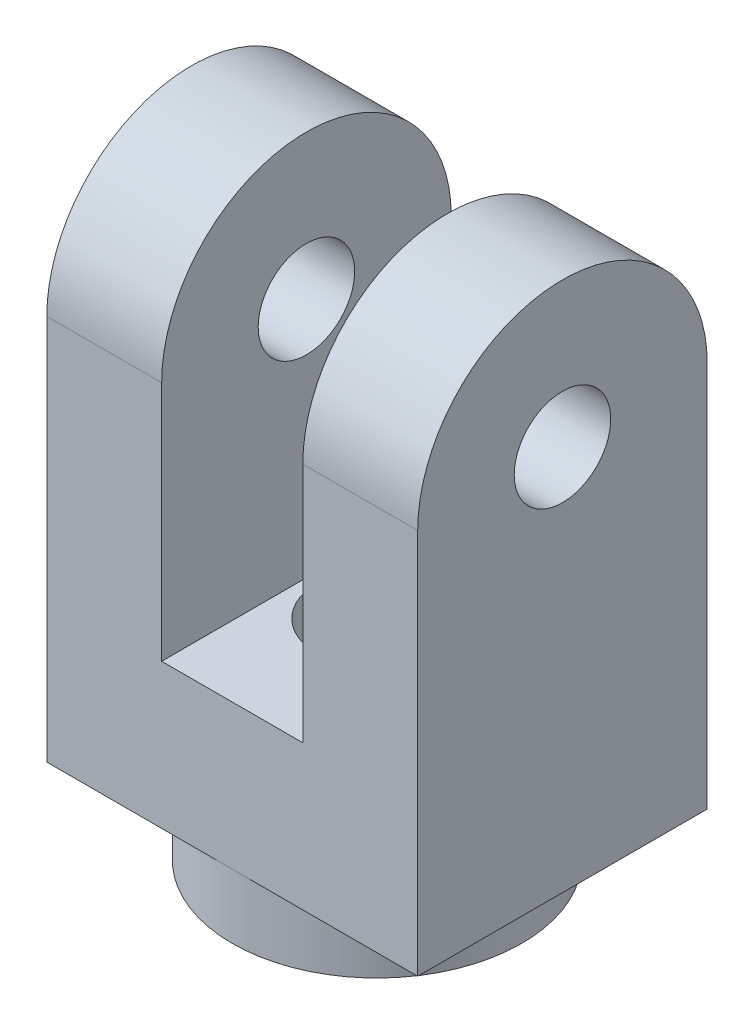
ISO-10303-21;
HEADER;
FILE_DESCRIPTION(('STEP AP214'),'2;1');
FILE_NAME('part.step','',(''),(''),'','','');
FILE_SCHEMA(('AUTOMOTIVE_DESIGN { 1 0 10303 214 1 1 1 1 }'));
ENDSEC;
DATA;
#1=APPLICATION_CONTEXT('core data for automotive mechanical design processes');
#2=APPLICATION_PROTOCOL_DEFINITION('international standard','automotive_design',2000,#1);
#3=PRODUCT_CONTEXT('',#1,'mechanical');
#4=PRODUCT('Part','Part','',(#3));
#5=PRODUCT_RELATED_PRODUCT_CATEGORY('part','',(#4));
#6=PRODUCT_DEFINITION_FORMATION('','',#4);
#7=PRODUCT_DEFINITION_CONTEXT('part definition',#1,'design');
#8=PRODUCT_DEFINITION('design','',#6,#7);
#9=PRODUCT_DEFINITION_SHAPE('','',#8);
#10=(LENGTH_UNIT() NAMED_UNIT(*) SI_UNIT(.MILLI.,.METRE.));
#11=(NAMED_UNIT(*) PLANE_ANGLE_UNIT() SI_UNIT($,.RADIAN.));
#12=(NAMED_UNIT(*) SI_UNIT($,.STERADIAN.) SOLID_ANGLE_UNIT());
#13=UNCERTAINTY_MEASURE_WITH_UNIT(LENGTH_MEASURE(1.E-05),#10,'distance_accuracy_value','');
#14=(GEOMETRIC_REPRESENTATION_CONTEXT(3) GLOBAL_UNCERTAINTY_ASSIGNED_CONTEXT((#13)) GLOBAL_UNIT_ASSIGNED_CONTEXT((#10,
#11,#12)) REPRESENTATION_CONTEXT('',''));
#15=CARTESIAN_POINT('',(0.,0.,0.));
#16=DIRECTION('',(0.,0.,1.));
#17=DIRECTION('',(1.,0.,0.));
#18=AXIS2_PLACEMENT_3D('',#15,#16,#17);
#19=CARTESIAN_POINT('',(0.,36.,0.));
#20=DIRECTION('',(0.,1.,0.));
#21=DIRECTION('',(0.,0.,1.));
#22=AXIS2_PLACEMENT_3D('',#19,#20,#21);
#23=PLANE('',#22);
#24=CARTESIAN_POINT('',(0.,36.,0.));
#25=DIRECTION('',(0.,1.,0.));
#26=DIRECTION('',(0.,0.,1.));
#27=AXIS2_PLACEMENT_3D('',#24,#25,#26);
#28=CIRCLE('',#27,15.);
#29=CARTESIAN_POINT('',(0.,36.,15.));
#30=VERTEX_POINT('',#29);
#31=EDGE_CURVE('E185',#30,#30,#28,.T.);
#32=ORIENTED_EDGE('',*,*,#31,.F.);
#33=EDGE_LOOP('',(#32));
#34=FACE_BOUND('',#33,.T.);
#35=DIRECTION('',(1.,0.,0.));
#36=VECTOR('',#35,1.);
#37=CARTESIAN_POINT('',(0.,36.,36.));
#38=LINE('',#37,#36);
#39=CARTESIAN_POINT('',(-17.55,36.,36.));
#40=VERTEX_POINT('',#39);
#41=CARTESIAN_POINT('',(17.55,36.,36.));
#42=VERTEX_POINT('',#41);
#43=EDGE_CURVE('E179',#40,#42,#38,.T.);
#44=ORIENTED_EDGE('',*,*,#43,.T.);
#45=DIRECTION('',(0.,0.,1.));
#46=VECTOR('',#45,1.);
#47=CARTESIAN_POINT('',(17.55,36.,-36.));
#48=LINE('',#47,#46);
#49=CARTESIAN_POINT('',(17.55,36.,-36.));
#50=VERTEX_POINT('',#49);
#51=EDGE_CURVE('E121',#50,#42,#48,.T.);
#52=ORIENTED_EDGE('',*,*,#51,.F.);
#53=DIRECTION('',(1.,0.,0.));
#54=VECTOR('',#53,1.);
#55=CARTESIAN_POINT('',(0.,36.,-36.));
#56=LINE('',#55,#54);
#57=CARTESIAN_POINT('',(-17.55,36.,-36.));
#58=VERTEX_POINT('',#57);
#59=EDGE_CURVE('E181',#58,#50,#56,.T.);
#60=ORIENTED_EDGE('',*,*,#59,.F.);
#61=DIRECTION('',(0.,0.,1.));
#62=VECTOR('',#61,1.);
#63=CARTESIAN_POINT('',(-17.55,36.,-36.));
#64=LINE('',#63,#62);
#65=EDGE_CURVE('E161',#58,#40,#64,.T.);
#66=ORIENTED_EDGE('',*,*,#65,.T.);
#67=EDGE_LOOP('',(#44,#52,#60,#66));
#68=FACE_BOUND('',#67,.T.);
#69=ADVANCED_FACE('F41',(#34,#68),#23,.T.);
#70=CARTESIAN_POINT('',(0.,0.,0.));
#71=DIRECTION('',(0.,1.,0.));
#72=DIRECTION('',(0.,0.,1.));
#73=AXIS2_PLACEMENT_3D('',#70,#71,#72);
#74=PLANE('',#73);
#75=DIRECTION('',(1.,0.,0.));
#76=VECTOR('',#75,1.);
#77=CARTESIAN_POINT('',(0.,0.,36.));
#78=LINE('',#77,#76);
#79=CARTESIAN_POINT('',(0.,0.,36.));
#80=VERTEX_POINT('',#79);
#81=CARTESIAN_POINT('',(46.125,0.,36.));
#82=VERTEX_POINT('',#81);
#83=EDGE_CURVE('E177',#80,#82,#78,.T.);
#84=ORIENTED_EDGE('',*,*,#83,.F.);
#85=CARTESIAN_POINT('',(0.,0.,0.));
#86=DIRECTION('',(0.,1.,0.));
#87=DIRECTION('',(0.,0.,1.));
#88=AXIS2_PLACEMENT_3D('',#85,#86,#87);
#89=CIRCLE('',#88,36.);
#90=CARTESIAN_POINT('',(0.,0.,-36.));
#91=VERTEX_POINT('',#90);
#92=EDGE_CURVE('E51',#80,#91,#89,.T.);
#93=ORIENTED_EDGE('',*,*,#92,.T.);
#94=DIRECTION('',(1.,0.,0.));
#95=VECTOR('',#94,1.);
#96=CARTESIAN_POINT('',(0.,0.,-36.));
#97=LINE('',#96,#95);
#98=CARTESIAN_POINT('',(46.125,0.,-36.));
#99=VERTEX_POINT('',#98);
#100=EDGE_CURVE('E195',#91,#99,#97,.T.);
#101=ORIENTED_EDGE('',*,*,#100,.T.);
#102=DIRECTION('',(0.,0.,1.));
#103=VECTOR('',#102,1.);
#104=CARTESIAN_POINT('',(46.125,0.,0.));
#105=LINE('',#104,#103);
#106=EDGE_CURVE('E192',#99,#82,#105,.T.);
#107=ORIENTED_EDGE('',*,*,#106,.T.);
#108=EDGE_LOOP('',(#84,#93,#101,#107));
#109=FACE_BOUND('',#108,.T.);
#110=ADVANCED_FACE('F213',(#109),#74,.F.);
#111=CARTESIAN_POINT('',(0.,36.,36.));
#112=DIRECTION('',(0.,0.,-1.));
#113=DIRECTION('',(-1.,0.,0.));
#114=AXIS2_PLACEMENT_3D('',#111,#112,#113);
#115=PLANE('',#114);
#116=DIRECTION('',(0.,-1.,0.));
#117=VECTOR('',#116,1.);
#118=CARTESIAN_POINT('',(-46.125,36.,36.));
#119=LINE('',#118,#117);
#120=CARTESIAN_POINT('',(-46.125,96.,36.));
#121=VERTEX_POINT('',#120);
#122=CARTESIAN_POINT('',(-46.125,0.,36.));
#123=VERTEX_POINT('',#122);
#124=EDGE_CURVE('E188',#121,#123,#119,.T.);
#125=ORIENTED_EDGE('',*,*,#124,.T.);
#126=EDGE_CURVE('E189',#123,#80,#78,.T.);
#127=ORIENTED_EDGE('',*,*,#126,.T.);
#128=ORIENTED_EDGE('',*,*,#83,.T.);
#129=DIRECTION('',(0.,-1.,0.));
#130=VECTOR('',#129,1.);
#131=CARTESIAN_POINT('',(46.125,36.,36.));
#132=LINE('',#131,#130);
#133=CARTESIAN_POINT('',(46.125,96.,36.));
#134=VERTEX_POINT('',#133);
#135=EDGE_CURVE('E45',#134,#82,#132,.T.);
#136=ORIENTED_EDGE('',*,*,#135,.F.);
#137=DIRECTION('',(1.,0.,0.));
#138=VECTOR('',#137,1.);
#139=CARTESIAN_POINT('',(17.55,96.,36.));
#140=LINE('',#139,#138);
#141=CARTESIAN_POINT('',(17.55,96.,36.));
#142=VERTEX_POINT('',#141);
#143=EDGE_CURVE('E127',#142,#134,#140,.T.);
#144=ORIENTED_EDGE('',*,*,#143,.F.);
#145=DIRECTION('',(0.,1.,0.));
#146=VECTOR('',#145,1.);
#147=CARTESIAN_POINT('',(17.55,36.,36.));
#148=LINE('',#147,#146);
#149=EDGE_CURVE('E113',#42,#142,#148,.T.);
#150=ORIENTED_EDGE('',*,*,#149,.F.);
#151=ORIENTED_EDGE('',*,*,#43,.F.);
#152=DIRECTION('',(0.,1.,0.));
#153=VECTOR('',#152,1.);
#154=CARTESIAN_POINT('',(-17.55,36.,36.));
#155=LINE('',#154,#153);
#156=CARTESIAN_POINT('',(-17.55,96.,36.));
#157=VERTEX_POINT('',#156);
#158=EDGE_CURVE('E58',#40,#157,#155,.T.);
#159=ORIENTED_EDGE('',*,*,#158,.T.);
#160=DIRECTION('',(-1.,0.,0.));
#161=VECTOR('',#160,1.);
#162=CARTESIAN_POINT('',(-17.55,96.,36.));
#163=LINE('',#162,#161);
#164=EDGE_CURVE('E167',#157,#121,#163,.T.);
#165=ORIENTED_EDGE('',*,*,#164,.T.);
#166=EDGE_LOOP('',(#125,#127,#128,#136,#144,#150,#151,#159,#165));
#167=FACE_BOUND('',#166,.T.);
#168=ADVANCED_FACE('F43',(#167),#115,.F.);
#169=CARTESIAN_POINT('',(46.125,36.,0.));
#170=DIRECTION('',(1.,0.,0.));
#171=DIRECTION('',(0.,0.,-1.));
#172=AXIS2_PLACEMENT_3D('',#169,#170,#171);
#173=PLANE('',#172);
#174=ORIENTED_EDGE('',*,*,#106,.F.);
#175=DIRECTION('',(0.,-1.,0.));
#176=VECTOR('',#175,1.);
#177=CARTESIAN_POINT('',(46.125,36.,-36.));
#178=LINE('',#177,#176);
#179=CARTESIAN_POINT('',(46.125,96.,-36.));
#180=VERTEX_POINT('',#179);
#181=EDGE_CURVE('E203',#180,#99,#178,.T.);
#182=ORIENTED_EDGE('',*,*,#181,.F.);
#183=CARTESIAN_POINT('',(46.125,96.,0.));
#184=DIRECTION('',(-1.,0.,0.));
#185=DIRECTION('',(0.,0.,1.));
#186=AXIS2_PLACEMENT_3D('',#183,#184,#185);
#187=CIRCLE('',#186,36.);
#188=EDGE_CURVE('E137',#134,#180,#187,.T.);
#189=ORIENTED_EDGE('',*,*,#188,.F.);
#190=ORIENTED_EDGE('',*,*,#135,.T.);
#191=EDGE_LOOP('',(#174,#182,#189,#190));
#192=FACE_BOUND('',#191,.T.);
#193=CARTESIAN_POINT('',(46.125,96.,0.));
#194=DIRECTION('',(-1.,0.,0.));
#195=DIRECTION('',(0.,0.,1.));
#196=AXIS2_PLACEMENT_3D('',#193,#194,#195);
#197=CIRCLE('',#196,12.);
#198=CARTESIAN_POINT('',(46.125,96.,12.));
#199=VERTEX_POINT('',#198);
#200=EDGE_CURVE('E142',#199,#199,#197,.T.);
#201=ORIENTED_EDGE('',*,*,#200,.T.);
#202=EDGE_LOOP('',(#201));
#203=FACE_BOUND('',#202,.T.);
#204=ADVANCED_FACE('F209',(#192,#203),#173,.T.);
#205=CARTESIAN_POINT('',(0.,36.,-36.));
#206=DIRECTION('',(0.,0.,-1.));
#207=DIRECTION('',(-1.,0.,0.));
#208=AXIS2_PLACEMENT_3D('',#205,#206,#207);
#209=PLANE('',#208);
#210=DIRECTION('',(0.,-1.,0.));
#211=VECTOR('',#210,1.);
#212=CARTESIAN_POINT('',(-17.55,36.,-36.));
#213=LINE('',#212,#211);
#214=CARTESIAN_POINT('',(-17.55,96.,-36.));
#215=VERTEX_POINT('',#214);
#216=EDGE_CURVE('E158',#215,#58,#213,.T.);
#217=ORIENTED_EDGE('',*,*,#216,.T.);
#218=ORIENTED_EDGE('',*,*,#59,.T.);
#219=DIRECTION('',(0.,-1.,0.));
#220=VECTOR('',#219,1.);
#221=CARTESIAN_POINT('',(17.55,36.,-36.));
#222=LINE('',#221,#220);
#223=CARTESIAN_POINT('',(17.55,96.,-36.));
#224=VERTEX_POINT('',#223);
#225=EDGE_CURVE('E133',#224,#50,#222,.T.);
#226=ORIENTED_EDGE('',*,*,#225,.F.);
#227=DIRECTION('',(1.,0.,0.));
#228=VECTOR('',#227,1.);
#229=CARTESIAN_POINT('',(17.55,96.,-36.));
#230=LINE('',#229,#228);
#231=EDGE_CURVE('E132',#224,#180,#230,.T.);
#232=ORIENTED_EDGE('',*,*,#231,.T.);
#233=ORIENTED_EDGE('',*,*,#181,.T.);
#234=ORIENTED_EDGE('',*,*,#100,.F.);
#235=CARTESIAN_POINT('',(-46.125,0.,-36.));
#236=VERTEX_POINT('',#235);
#237=EDGE_CURVE('E196',#236,#91,#97,.T.);
#238=ORIENTED_EDGE('',*,*,#237,.F.);
#239=DIRECTION('',(0.,-1.,0.));
#240=VECTOR('',#239,1.);
#241=CARTESIAN_POINT('',(-46.125,36.,-36.));
#242=LINE('',#241,#240);
#243=CARTESIAN_POINT('',(-46.125,96.,-36.));
#244=VERTEX_POINT('',#243);
#245=EDGE_CURVE('E202',#244,#236,#242,.T.);
#246=ORIENTED_EDGE('',*,*,#245,.F.);
#247=DIRECTION('',(-1.,0.,0.));
#248=VECTOR('',#247,1.);
#249=CARTESIAN_POINT('',(-17.55,96.,-36.));
#250=LINE('',#249,#248);
#251=EDGE_CURVE('E164',#215,#244,#250,.T.);
#252=ORIENTED_EDGE('',*,*,#251,.F.);
#253=EDGE_LOOP('',(#217,#218,#226,#232,#233,#234,#238,#246,#252));
#254=FACE_BOUND('',#253,.T.);
#255=ADVANCED_FACE('F215',(#254),#209,.T.);
#256=CARTESIAN_POINT('',(-46.125,36.,0.));
#257=DIRECTION('',(1.,0.,0.));
#258=DIRECTION('',(0.,0.,-1.));
#259=AXIS2_PLACEMENT_3D('',#256,#257,#258);
#260=PLANE('',#259);
#261=ORIENTED_EDGE('',*,*,#245,.T.);
#262=DIRECTION('',(0.,0.,1.));
#263=VECTOR('',#262,1.);
#264=CARTESIAN_POINT('',(-46.125,0.,0.));
#265=LINE('',#264,#263);
#266=EDGE_CURVE('E182',#236,#123,#265,.T.);
#267=ORIENTED_EDGE('',*,*,#266,.T.);
#268=ORIENTED_EDGE('',*,*,#124,.F.);
#269=CARTESIAN_POINT('',(-46.125,96.,0.));
#270=DIRECTION('',(-1.,0.,0.));
#271=DIRECTION('',(0.,0.,1.));
#272=AXIS2_PLACEMENT_3D('',#269,#270,#271);
#273=CIRCLE('',#272,36.);
#274=EDGE_CURVE('E152',#121,#244,#273,.T.);
#275=ORIENTED_EDGE('',*,*,#274,.T.);
#276=EDGE_LOOP('',(#261,#267,#268,#275));
#277=FACE_BOUND('',#276,.T.);
#278=CARTESIAN_POINT('',(-46.125,96.,0.));
#279=DIRECTION('',(-1.,0.,0.));
#280=DIRECTION('',(0.,0.,1.));
#281=AXIS2_PLACEMENT_3D('',#278,#279,#280);
#282=CIRCLE('',#281,12.);
#283=CARTESIAN_POINT('',(-46.125,96.,12.));
#284=VERTEX_POINT('',#283);
#285=EDGE_CURVE('E147',#284,#284,#282,.T.);
#286=ORIENTED_EDGE('',*,*,#285,.F.);
#287=EDGE_LOOP('',(#286));
#288=FACE_BOUND('',#287,.T.);
#289=ADVANCED_FACE('F221',(#277,#288),#260,.F.);
#290=CARTESIAN_POINT('',(0.,36.,0.));
#291=DIRECTION('',(0.,-1.,0.));
#292=DIRECTION('',(0.,0.,-1.));
#293=AXIS2_PLACEMENT_3D('',#290,#291,#292);
#294=CYLINDRICAL_SURFACE('',#293,15.);
#295=ORIENTED_EDGE('',*,*,#31,.T.);
#296=EDGE_LOOP('',(#295));
#297=FACE_BOUND('',#296,.T.);
#298=CARTESIAN_POINT('',(0.,-16.,0.));
#299=DIRECTION('',(0.,1.,0.));
#300=DIRECTION('',(0.,0.,1.));
#301=AXIS2_PLACEMENT_3D('',#298,#299,#300);
#302=CIRCLE('',#301,15.);
#303=CARTESIAN_POINT('',(0.,-16.,15.));
#304=VERTEX_POINT('',#303);
#305=EDGE_CURVE('E172',#304,#304,#302,.T.);
#306=ORIENTED_EDGE('',*,*,#305,.F.);
#307=EDGE_LOOP('',(#306));
#308=FACE_BOUND('',#307,.T.);
#309=ADVANCED_FACE('F243',(#297,#308),#294,.F.);
#310=ORIENTED_EDGE('',*,*,#237,.T.);
#311=EDGE_CURVE('E11',#91,#80,#89,.T.);
#312=ORIENTED_EDGE('',*,*,#311,.T.);
#313=ORIENTED_EDGE('',*,*,#126,.F.);
#314=ORIENTED_EDGE('',*,*,#266,.F.);
#315=EDGE_LOOP('',(#310,#312,#313,#314));
#316=FACE_BOUND('',#315,.T.);
#317=ADVANCED_FACE('F218',(#316),#74,.F.);
#318=CARTESIAN_POINT('',(0.,-16.,0.));
#319=DIRECTION('',(0.,1.,0.));
#320=DIRECTION('',(0.,0.,1.));
#321=AXIS2_PLACEMENT_3D('',#318,#319,#320);
#322=CYLINDRICAL_SURFACE('',#321,36.);
#323=CARTESIAN_POINT('',(0.,-16.,0.));
#324=DIRECTION('',(0.,1.,0.));
#325=DIRECTION('',(0.,0.,1.));
#326=AXIS2_PLACEMENT_3D('',#323,#324,#325);
#327=CIRCLE('',#326,36.);
#328=CARTESIAN_POINT('',(0.,-16.,36.));
#329=VERTEX_POINT('',#328);
#330=EDGE_CURVE('E175',#329,#329,#327,.T.);
#331=ORIENTED_EDGE('',*,*,#330,.T.);
#332=EDGE_LOOP('',(#331));
#333=FACE_BOUND('',#332,.T.);
#334=ORIENTED_EDGE('',*,*,#92,.F.);
#335=ORIENTED_EDGE('',*,*,#311,.F.);
#336=EDGE_LOOP('',(#334,#335));
#337=FACE_BOUND('',#336,.T.);
#338=ADVANCED_FACE('F239',(#333,#337),#322,.T.);
#339=CARTESIAN_POINT('',(0.,-16.,0.));
#340=DIRECTION('',(0.,1.,0.));
#341=DIRECTION('',(0.,0.,1.));
#342=AXIS2_PLACEMENT_3D('',#339,#340,#341);
#343=PLANE('',#342);
#344=ORIENTED_EDGE('',*,*,#305,.T.);
#345=EDGE_LOOP('',(#344));
#346=FACE_BOUND('',#345,.T.);
#347=ORIENTED_EDGE('',*,*,#330,.F.);
#348=EDGE_LOOP('',(#347));
#349=FACE_BOUND('',#348,.T.);
#350=ADVANCED_FACE('F279',(#346,#349),#343,.F.);
#351=CARTESIAN_POINT('',(-17.55,96.,0.));
#352=DIRECTION('',(-1.,0.,0.));
#353=DIRECTION('',(0.,0.,1.));
#354=AXIS2_PLACEMENT_3D('',#351,#352,#353);
#355=CYLINDRICAL_SURFACE('',#354,36.);
#356=ORIENTED_EDGE('',*,*,#274,.F.);
#357=ORIENTED_EDGE('',*,*,#164,.F.);
#358=CARTESIAN_POINT('',(-17.55,96.,0.));
#359=DIRECTION('',(-1.,0.,0.));
#360=DIRECTION('',(0.,0.,1.));
#361=AXIS2_PLACEMENT_3D('',#358,#359,#360);
#362=CIRCLE('',#361,36.);
#363=EDGE_CURVE('E155',#157,#215,#362,.T.);
#364=ORIENTED_EDGE('',*,*,#363,.T.);
#365=ORIENTED_EDGE('',*,*,#251,.T.);
#366=EDGE_LOOP('',(#356,#357,#364,#365));
#367=FACE_BOUND('',#366,.T.);
#368=ADVANCED_FACE('F226',(#367),#355,.T.);
#369=CARTESIAN_POINT('',(-17.55,96.,0.));
#370=DIRECTION('',(-1.,0.,0.));
#371=DIRECTION('',(0.,0.,1.));
#372=AXIS2_PLACEMENT_3D('',#369,#370,#371);
#373=PLANE('',#372);
#374=CARTESIAN_POINT('',(-17.55,96.,0.));
#375=DIRECTION('',(-1.,0.,0.));
#376=DIRECTION('',(0.,0.,1.));
#377=AXIS2_PLACEMENT_3D('',#374,#375,#376);
#378=CIRCLE('',#377,12.);
#379=CARTESIAN_POINT('',(-17.55,96.,12.));
#380=VERTEX_POINT('',#379);
#381=EDGE_CURVE('E149',#380,#380,#378,.T.);
#382=ORIENTED_EDGE('',*,*,#381,.T.);
#383=EDGE_LOOP('',(#382));
#384=FACE_BOUND('',#383,.T.);
#385=ORIENTED_EDGE('',*,*,#363,.F.);
#386=ORIENTED_EDGE('',*,*,#158,.F.);
#387=ORIENTED_EDGE('',*,*,#65,.F.);
#388=ORIENTED_EDGE('',*,*,#216,.F.);
#389=EDGE_LOOP('',(#385,#386,#387,#388));
#390=FACE_BOUND('',#389,.T.);
#391=ADVANCED_FACE('F227',(#384,#390),#373,.F.);
#392=CARTESIAN_POINT('',(-17.55,96.,0.));
#393=DIRECTION('',(-1.,0.,0.));
#394=DIRECTION('',(0.,0.,1.));
#395=AXIS2_PLACEMENT_3D('',#392,#393,#394);
#396=CYLINDRICAL_SURFACE('',#395,12.);
#397=ORIENTED_EDGE('',*,*,#381,.F.);
#398=EDGE_LOOP('',(#397));
#399=FACE_BOUND('',#398,.T.);
#400=ORIENTED_EDGE('',*,*,#285,.T.);
#401=EDGE_LOOP('',(#400));
#402=FACE_BOUND('',#401,.T.);
#403=ADVANCED_FACE('F306',(#399,#402),#396,.F.);
#404=CARTESIAN_POINT('',(17.55,96.,0.));
#405=DIRECTION('',(1.,0.,0.));
#406=DIRECTION('',(0.,0.,1.));
#407=AXIS2_PLACEMENT_3D('',#404,#405,#406);
#408=PLANE('',#407);
#409=CARTESIAN_POINT('',(17.55,96.,0.));
#410=DIRECTION('',(-1.,0.,0.));
#411=DIRECTION('',(0.,0.,1.));
#412=AXIS2_PLACEMENT_3D('',#409,#410,#411);
#413=CIRCLE('',#412,36.);
#414=EDGE_CURVE('E118',#142,#224,#413,.T.);
#415=ORIENTED_EDGE('',*,*,#414,.T.);
#416=ORIENTED_EDGE('',*,*,#225,.T.);
#417=ORIENTED_EDGE('',*,*,#51,.T.);
#418=ORIENTED_EDGE('',*,*,#149,.T.);
#419=EDGE_LOOP('',(#415,#416,#417,#418));
#420=FACE_BOUND('',#419,.T.);
#421=CARTESIAN_POINT('',(17.55,96.,0.));
#422=DIRECTION('',(-1.,0.,0.));
#423=DIRECTION('',(0.,0.,1.));
#424=AXIS2_PLACEMENT_3D('',#421,#422,#423);
#425=CIRCLE('',#424,12.);
#426=CARTESIAN_POINT('',(17.55,96.,12.));
#427=VERTEX_POINT('',#426);
#428=EDGE_CURVE('E139',#427,#427,#425,.T.);
#429=ORIENTED_EDGE('',*,*,#428,.F.);
#430=EDGE_LOOP('',(#429));
#431=FACE_BOUND('',#430,.T.);
#432=ADVANCED_FACE('F115',(#420,#431),#408,.F.);
#433=CARTESIAN_POINT('',(17.55,96.,0.));
#434=DIRECTION('',(1.,0.,0.));
#435=DIRECTION('',(0.,0.,-1.));
#436=AXIS2_PLACEMENT_3D('',#433,#434,#435);
#437=CYLINDRICAL_SURFACE('',#436,36.);
#438=ORIENTED_EDGE('',*,*,#188,.T.);
#439=ORIENTED_EDGE('',*,*,#231,.F.);
#440=ORIENTED_EDGE('',*,*,#414,.F.);
#441=ORIENTED_EDGE('',*,*,#143,.T.);
#442=EDGE_LOOP('',(#438,#439,#440,#441));
#443=FACE_BOUND('',#442,.T.);
#444=ADVANCED_FACE('F135',(#443),#437,.T.);
#445=CARTESIAN_POINT('',(17.55,96.,0.));
#446=DIRECTION('',(1.,0.,0.));
#447=DIRECTION('',(0.,0.,-1.));
#448=AXIS2_PLACEMENT_3D('',#445,#446,#447);
#449=CYLINDRICAL_SURFACE('',#448,12.);
#450=ORIENTED_EDGE('',*,*,#428,.T.);
#451=EDGE_LOOP('',(#450));
#452=FACE_BOUND('',#451,.T.);
#453=ORIENTED_EDGE('',*,*,#200,.F.);
#454=EDGE_LOOP('',(#453));
#455=FACE_BOUND('',#454,.T.);
#456=ADVANCED_FACE('F364',(#452,#455),#449,.F.);
#457=CLOSED_SHELL('',(#69,#110,#168,#204,#255,#289,#309,#317,#338,#350,#368,#391,#403,#432,#444,#456));
#458=MANIFOLD_SOLID_BREP('B2',#457);
#459=ADVANCED_BREP_SHAPE_REPRESENTATION('',(#18,#458),#14);
#460=SHAPE_DEFINITION_REPRESENTATION(#9,#459);
ENDSEC;
END-ISO-10303-21;
